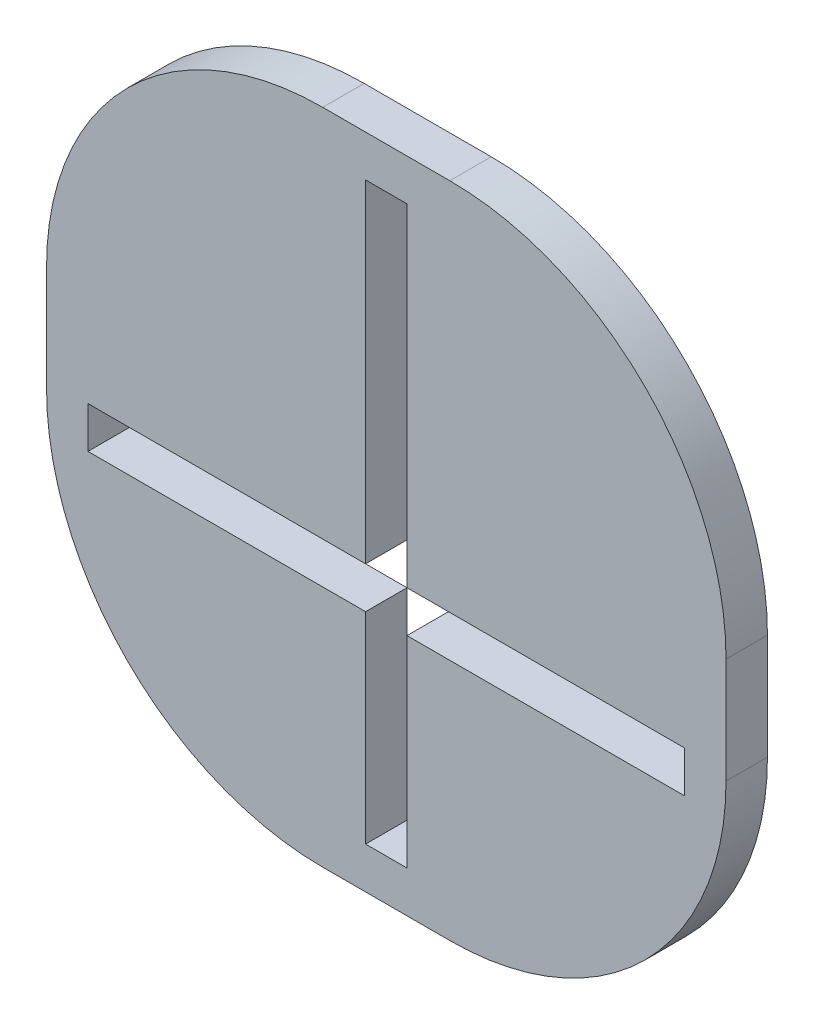
ISO-10303-21;
HEADER;
FILE_DESCRIPTION(('STEP AP214'),'2;1');
FILE_NAME('part.step','',(''),(''),'','','');
FILE_SCHEMA(('AUTOMOTIVE_DESIGN { 1 0 10303 214 1 1 1 1 }'));
ENDSEC;
DATA;
#1=APPLICATION_CONTEXT('core data for automotive mechanical design processes');
#2=APPLICATION_PROTOCOL_DEFINITION('international standard','automotive_design',2000,#1);
#3=PRODUCT_CONTEXT('',#1,'mechanical');
#4=PRODUCT('Part','Part','',(#3));
#5=PRODUCT_RELATED_PRODUCT_CATEGORY('part','',(#4));
#6=PRODUCT_DEFINITION_FORMATION('','',#4);
#7=PRODUCT_DEFINITION_CONTEXT('part definition',#1,'design');
#8=PRODUCT_DEFINITION('design','',#6,#7);
#9=PRODUCT_DEFINITION_SHAPE('','',#8);
#10=(LENGTH_UNIT() NAMED_UNIT(*) SI_UNIT(.MILLI.,.METRE.));
#11=(NAMED_UNIT(*) PLANE_ANGLE_UNIT() SI_UNIT($,.RADIAN.));
#12=(NAMED_UNIT(*) SI_UNIT($,.STERADIAN.) SOLID_ANGLE_UNIT());
#13=UNCERTAINTY_MEASURE_WITH_UNIT(LENGTH_MEASURE(1.E-05),#10,'distance_accuracy_value','');
#14=(GEOMETRIC_REPRESENTATION_CONTEXT(3) GLOBAL_UNCERTAINTY_ASSIGNED_CONTEXT((#13)) GLOBAL_UNIT_ASSIGNED_CONTEXT((#10,
#11,#12)) REPRESENTATION_CONTEXT('',''));
#15=CARTESIAN_POINT('',(0.,0.,0.));
#16=DIRECTION('',(0.,0.,1.));
#17=DIRECTION('',(1.,0.,0.));
#18=AXIS2_PLACEMENT_3D('',#15,#16,#17);
#19=CARTESIAN_POINT('',(0.,23.825,3.));
#20=DIRECTION('',(0.,-1.,0.));
#21=DIRECTION('',(1.,0.,0.));
#22=AXIS2_PLACEMENT_3D('',#19,#20,#21);
#23=PLANE('',#22);
#24=DIRECTION('',(-1.,0.,0.));
#25=VECTOR('',#24,1.);
#26=CARTESIAN_POINT('',(0.,23.825,0.));
#27=LINE('',#26,#25);
#28=CARTESIAN_POINT('',(4.59999999999999,23.825,0.));
#29=VERTEX_POINT('',#28);
#30=CARTESIAN_POINT('',(-4.60000000000002,23.825,0.));
#31=VERTEX_POINT('',#30);
#32=EDGE_CURVE('E254',#29,#31,#27,.T.);
#33=ORIENTED_EDGE('',*,*,#32,.T.);
#34=DIRECTION('',(0.,0.,-1.));
#35=VECTOR('',#34,1.);
#36=CARTESIAN_POINT('',(-4.60000000000002,23.825,3.));
#37=LINE('',#36,#35);
#38=CARTESIAN_POINT('',(-4.60000000000002,23.825,3.));
#39=VERTEX_POINT('',#38);
#40=EDGE_CURVE('E11',#39,#31,#37,.T.);
#41=ORIENTED_EDGE('',*,*,#40,.F.);
#42=DIRECTION('',(-1.,0.,0.));
#43=VECTOR('',#42,1.);
#44=CARTESIAN_POINT('',(0.,23.825,3.));
#45=LINE('',#44,#43);
#46=CARTESIAN_POINT('',(4.59999999999999,23.825,3.));
#47=VERTEX_POINT('',#46);
#48=EDGE_CURVE('E405',#47,#39,#45,.T.);
#49=ORIENTED_EDGE('',*,*,#48,.F.);
#50=DIRECTION('',(0.,0.,-1.));
#51=VECTOR('',#50,1.);
#52=CARTESIAN_POINT('',(4.59999999999999,23.825,3.));
#53=LINE('',#52,#51);
#54=EDGE_CURVE('E281',#47,#29,#53,.T.);
#55=ORIENTED_EDGE('',*,*,#54,.T.);
#56=EDGE_LOOP('',(#33,#41,#49,#55));
#57=FACE_BOUND('',#56,.T.);
#58=ADVANCED_FACE('F45',(#57),#23,.F.);
#59=CARTESIAN_POINT('',(-4.60000000000002,3.82500000000002,3.));
#60=DIRECTION('',(0.,0.,-1.));
#61=DIRECTION('',(-1.,0.,0.));
#62=AXIS2_PLACEMENT_3D('',#59,#60,#61);
#63=CYLINDRICAL_SURFACE('',#62,20.);
#64=CARTESIAN_POINT('',(-4.60000000000002,3.82500000000002,0.));
#65=DIRECTION('',(0.,0.,1.));
#66=DIRECTION('',(1.,0.,0.));
#67=AXIS2_PLACEMENT_3D('',#64,#65,#66);
#68=CIRCLE('',#67,20.);
#69=CARTESIAN_POINT('',(-24.6,3.82500000000001,0.));
#70=VERTEX_POINT('',#69);
#71=EDGE_CURVE('E258',#31,#70,#68,.T.);
#72=ORIENTED_EDGE('',*,*,#71,.T.);
#73=DIRECTION('',(0.,0.,-1.));
#74=VECTOR('',#73,1.);
#75=CARTESIAN_POINT('',(-24.6,3.82500000000001,3.));
#76=LINE('',#75,#74);
#77=CARTESIAN_POINT('',(-24.6,3.82500000000001,3.));
#78=VERTEX_POINT('',#77);
#79=EDGE_CURVE('E56',#78,#70,#76,.T.);
#80=ORIENTED_EDGE('',*,*,#79,.F.);
#81=CARTESIAN_POINT('',(-4.60000000000002,3.82500000000002,3.));
#82=DIRECTION('',(0.,0.,1.));
#83=DIRECTION('',(1.,0.,0.));
#84=AXIS2_PLACEMENT_3D('',#81,#82,#83);
#85=CIRCLE('',#84,20.);
#86=EDGE_CURVE('E408',#39,#78,#85,.T.);
#87=ORIENTED_EDGE('',*,*,#86,.F.);
#88=ORIENTED_EDGE('',*,*,#40,.T.);
#89=EDGE_LOOP('',(#72,#80,#87,#88));
#90=FACE_BOUND('',#89,.T.);
#91=ADVANCED_FACE('F440',(#90),#63,.T.);
#92=CARTESIAN_POINT('',(-24.6,0.,3.));
#93=DIRECTION('',(-1.,0.,0.));
#94=DIRECTION('',(0.,-1.,0.));
#95=AXIS2_PLACEMENT_3D('',#92,#93,#94);
#96=PLANE('',#95);
#97=DIRECTION('',(0.,1.,0.));
#98=VECTOR('',#97,1.);
#99=CARTESIAN_POINT('',(-24.6,0.,0.));
#100=LINE('',#99,#98);
#101=CARTESIAN_POINT('',(-24.6,-3.82500000000002,0.));
#102=VERTEX_POINT('',#101);
#103=EDGE_CURVE('E262',#102,#70,#100,.T.);
#104=ORIENTED_EDGE('',*,*,#103,.F.);
#105=DIRECTION('',(0.,0.,-1.));
#106=VECTOR('',#105,1.);
#107=CARTESIAN_POINT('',(-24.6,-3.82500000000002,3.));
#108=LINE('',#107,#106);
#109=CARTESIAN_POINT('',(-24.6,-3.82500000000002,3.));
#110=VERTEX_POINT('',#109);
#111=EDGE_CURVE('E291',#110,#102,#108,.T.);
#112=ORIENTED_EDGE('',*,*,#111,.F.);
#113=DIRECTION('',(0.,1.,0.));
#114=VECTOR('',#113,1.);
#115=CARTESIAN_POINT('',(-24.6,0.,3.));
#116=LINE('',#115,#114);
#117=EDGE_CURVE('E411',#110,#78,#116,.T.);
#118=ORIENTED_EDGE('',*,*,#117,.T.);
#119=ORIENTED_EDGE('',*,*,#79,.T.);
#120=EDGE_LOOP('',(#104,#112,#118,#119));
#121=FACE_BOUND('',#120,.T.);
#122=ADVANCED_FACE('F445',(#121),#96,.T.);
#123=CARTESIAN_POINT('',(-4.60000000000002,-3.82500000000001,3.));
#124=DIRECTION('',(0.,0.,-1.));
#125=DIRECTION('',(-1.,0.,0.));
#126=AXIS2_PLACEMENT_3D('',#123,#124,#125);
#127=CYLINDRICAL_SURFACE('',#126,20.);
#128=CARTESIAN_POINT('',(-4.60000000000002,-3.82500000000001,0.));
#129=DIRECTION('',(0.,0.,1.));
#130=DIRECTION('',(1.,0.,0.));
#131=AXIS2_PLACEMENT_3D('',#128,#129,#130);
#132=CIRCLE('',#131,20.);
#133=CARTESIAN_POINT('',(-4.60000000000001,-23.825,0.));
#134=VERTEX_POINT('',#133);
#135=EDGE_CURVE('E266',#134,#102,#132,.F.);
#136=ORIENTED_EDGE('',*,*,#135,.F.);
#137=DIRECTION('',(0.,0.,-1.));
#138=VECTOR('',#137,1.);
#139=CARTESIAN_POINT('',(-4.60000000000001,-23.825,3.));
#140=LINE('',#139,#138);
#141=CARTESIAN_POINT('',(-4.60000000000001,-23.825,3.));
#142=VERTEX_POINT('',#141);
#143=EDGE_CURVE('E288',#142,#134,#140,.T.);
#144=ORIENTED_EDGE('',*,*,#143,.F.);
#145=CARTESIAN_POINT('',(-4.60000000000002,-3.82500000000001,3.));
#146=DIRECTION('',(0.,0.,1.));
#147=DIRECTION('',(1.,0.,0.));
#148=AXIS2_PLACEMENT_3D('',#145,#146,#147);
#149=CIRCLE('',#148,20.);
#150=EDGE_CURVE('E415',#142,#110,#149,.F.);
#151=ORIENTED_EDGE('',*,*,#150,.T.);
#152=ORIENTED_EDGE('',*,*,#111,.T.);
#153=EDGE_LOOP('',(#136,#144,#151,#152));
#154=FACE_BOUND('',#153,.T.);
#155=ADVANCED_FACE('F608',(#154),#127,.T.);
#156=CARTESIAN_POINT('',(0.,-23.825,3.));
#157=DIRECTION('',(0.,-1.,0.));
#158=DIRECTION('',(1.,0.,0.));
#159=AXIS2_PLACEMENT_3D('',#156,#157,#158);
#160=PLANE('',#159);
#161=DIRECTION('',(-1.,0.,0.));
#162=VECTOR('',#161,1.);
#163=CARTESIAN_POINT('',(0.,-23.825,0.));
#164=LINE('',#163,#162);
#165=CARTESIAN_POINT('',(4.60000000000001,-23.825,0.));
#166=VERTEX_POINT('',#165);
#167=EDGE_CURVE('E270',#166,#134,#164,.T.);
#168=ORIENTED_EDGE('',*,*,#167,.F.);
#169=DIRECTION('',(0.,0.,-1.));
#170=VECTOR('',#169,1.);
#171=CARTESIAN_POINT('',(4.60000000000001,-23.825,3.));
#172=LINE('',#171,#170);
#173=CARTESIAN_POINT('',(4.60000000000001,-23.825,3.));
#174=VERTEX_POINT('',#173);
#175=EDGE_CURVE('E212',#174,#166,#172,.T.);
#176=ORIENTED_EDGE('',*,*,#175,.F.);
#177=DIRECTION('',(-1.,0.,0.));
#178=VECTOR('',#177,1.);
#179=CARTESIAN_POINT('',(0.,-23.825,3.));
#180=LINE('',#179,#178);
#181=EDGE_CURVE('E203',#174,#142,#180,.T.);
#182=ORIENTED_EDGE('',*,*,#181,.T.);
#183=ORIENTED_EDGE('',*,*,#143,.T.);
#184=EDGE_LOOP('',(#168,#176,#182,#183));
#185=FACE_BOUND('',#184,.T.);
#186=ADVANCED_FACE('F421',(#185),#160,.T.);
#187=CARTESIAN_POINT('',(4.6,-3.825,3.));
#188=DIRECTION('',(0.,0.,-1.));
#189=DIRECTION('',(-1.,0.,0.));
#190=AXIS2_PLACEMENT_3D('',#187,#188,#189);
#191=CYLINDRICAL_SURFACE('',#190,20.);
#192=CARTESIAN_POINT('',(4.6,-3.825,0.));
#193=DIRECTION('',(0.,0.,1.));
#194=DIRECTION('',(1.,0.,0.));
#195=AXIS2_PLACEMENT_3D('',#192,#193,#194);
#196=CIRCLE('',#195,20.);
#197=CARTESIAN_POINT('',(24.6,-3.825,0.));
#198=VERTEX_POINT('',#197);
#199=EDGE_CURVE('E210',#166,#198,#196,.T.);
#200=ORIENTED_EDGE('',*,*,#199,.T.);
#201=DIRECTION('',(0.,0.,-1.));
#202=VECTOR('',#201,1.);
#203=CARTESIAN_POINT('',(24.6,-3.825,3.));
#204=LINE('',#203,#202);
#205=CARTESIAN_POINT('',(24.6,-3.825,3.));
#206=VERTEX_POINT('',#205);
#207=EDGE_CURVE('E207',#206,#198,#204,.T.);
#208=ORIENTED_EDGE('',*,*,#207,.F.);
#209=CARTESIAN_POINT('',(4.6,-3.825,3.));
#210=DIRECTION('',(0.,0.,1.));
#211=DIRECTION('',(1.,0.,0.));
#212=AXIS2_PLACEMENT_3D('',#209,#210,#211);
#213=CIRCLE('',#212,20.);
#214=EDGE_CURVE('E196',#174,#206,#213,.T.);
#215=ORIENTED_EDGE('',*,*,#214,.F.);
#216=ORIENTED_EDGE('',*,*,#175,.T.);
#217=EDGE_LOOP('',(#200,#208,#215,#216));
#218=FACE_BOUND('',#217,.T.);
#219=ADVANCED_FACE('F208',(#218),#191,.T.);
#220=CARTESIAN_POINT('',(24.6,0.,3.));
#221=DIRECTION('',(-1.,0.,0.));
#222=DIRECTION('',(0.,-1.,0.));
#223=AXIS2_PLACEMENT_3D('',#220,#221,#222);
#224=PLANE('',#223);
#225=DIRECTION('',(0.,1.,0.));
#226=VECTOR('',#225,1.);
#227=CARTESIAN_POINT('',(24.6,0.,0.));
#228=LINE('',#227,#226);
#229=CARTESIAN_POINT('',(24.6,3.82500000000002,0.));
#230=VERTEX_POINT('',#229);
#231=EDGE_CURVE('E130',#198,#230,#228,.T.);
#232=ORIENTED_EDGE('',*,*,#231,.T.);
#233=DIRECTION('',(0.,0.,-1.));
#234=VECTOR('',#233,1.);
#235=CARTESIAN_POINT('',(24.6,3.82500000000002,3.));
#236=LINE('',#235,#234);
#237=CARTESIAN_POINT('',(24.6,3.82500000000002,3.));
#238=VERTEX_POINT('',#237);
#239=EDGE_CURVE('E213',#238,#230,#236,.T.);
#240=ORIENTED_EDGE('',*,*,#239,.F.);
#241=DIRECTION('',(0.,1.,0.));
#242=VECTOR('',#241,1.);
#243=CARTESIAN_POINT('',(24.6,0.,3.));
#244=LINE('',#243,#242);
#245=EDGE_CURVE('E200',#206,#238,#244,.T.);
#246=ORIENTED_EDGE('',*,*,#245,.F.);
#247=ORIENTED_EDGE('',*,*,#207,.T.);
#248=EDGE_LOOP('',(#232,#240,#246,#247));
#249=FACE_BOUND('',#248,.T.);
#250=ADVANCED_FACE('F215',(#249),#224,.F.);
#251=CARTESIAN_POINT('',(0.,20.825,3.));
#252=DIRECTION('',(0.,1.,0.));
#253=DIRECTION('',(0.,0.,1.));
#254=AXIS2_PLACEMENT_3D('',#251,#252,#253);
#255=PLANE('',#254);
#256=DIRECTION('',(1.,0.,0.));
#257=VECTOR('',#256,1.);
#258=CARTESIAN_POINT('',(0.,20.825,0.));
#259=LINE('',#258,#257);
#260=CARTESIAN_POINT('',(-1.50000000000001,20.825,0.));
#261=VERTEX_POINT('',#260);
#262=CARTESIAN_POINT('',(1.50000000000001,20.825,0.));
#263=VERTEX_POINT('',#262);
#264=EDGE_CURVE('E223',#261,#263,#259,.T.);
#265=ORIENTED_EDGE('',*,*,#264,.T.);
#266=DIRECTION('',(0.,0.,-1.));
#267=VECTOR('',#266,1.);
#268=CARTESIAN_POINT('',(1.50000000000001,20.825,3.));
#269=LINE('',#268,#267);
#270=CARTESIAN_POINT('',(1.50000000000001,20.825,3.));
#271=VERTEX_POINT('',#270);
#272=EDGE_CURVE('E49',#271,#263,#269,.T.);
#273=ORIENTED_EDGE('',*,*,#272,.F.);
#274=DIRECTION('',(1.,0.,0.));
#275=VECTOR('',#274,1.);
#276=CARTESIAN_POINT('',(0.,20.825,3.));
#277=LINE('',#276,#275);
#278=CARTESIAN_POINT('',(-1.50000000000001,20.825,3.));
#279=VERTEX_POINT('',#278);
#280=EDGE_CURVE('E280',#279,#271,#277,.T.);
#281=ORIENTED_EDGE('',*,*,#280,.F.);
#282=DIRECTION('',(0.,0.,-1.));
#283=VECTOR('',#282,1.);
#284=CARTESIAN_POINT('',(-1.50000000000001,20.825,3.));
#285=LINE('',#284,#283);
#286=EDGE_CURVE('E219',#279,#261,#285,.T.);
#287=ORIENTED_EDGE('',*,*,#286,.T.);
#288=EDGE_LOOP('',(#265,#273,#281,#287));
#289=FACE_BOUND('',#288,.T.);
#290=ADVANCED_FACE('F47',(#289),#255,.F.);
#291=CARTESIAN_POINT('',(1.50000000000001,0.,3.));
#292=DIRECTION('',(1.,0.,0.));
#293=DIRECTION('',(0.,0.,-1.));
#294=AXIS2_PLACEMENT_3D('',#291,#292,#293);
#295=PLANE('',#294);
#296=DIRECTION('',(0.,-1.,0.));
#297=VECTOR('',#296,1.);
#298=CARTESIAN_POINT('',(1.50000000000001,0.,0.));
#299=LINE('',#298,#297);
#300=CARTESIAN_POINT('',(1.50000000000001,-3.25,0.));
#301=VERTEX_POINT('',#300);
#302=EDGE_CURVE('E227',#263,#301,#299,.T.);
#303=ORIENTED_EDGE('',*,*,#302,.T.);
#304=DIRECTION('',(0.,0.,-1.));
#305=VECTOR('',#304,1.);
#306=CARTESIAN_POINT('',(1.50000000000001,-3.25,3.));
#307=LINE('',#306,#305);
#308=CARTESIAN_POINT('',(1.50000000000001,-3.25,3.));
#309=VERTEX_POINT('',#308);
#310=EDGE_CURVE('E329',#309,#301,#307,.T.);
#311=ORIENTED_EDGE('',*,*,#310,.F.);
#312=DIRECTION('',(0.,-1.,0.));
#313=VECTOR('',#312,1.);
#314=CARTESIAN_POINT('',(1.50000000000001,0.,3.));
#315=LINE('',#314,#313);
#316=EDGE_CURVE('E145',#271,#309,#315,.T.);
#317=ORIENTED_EDGE('',*,*,#316,.F.);
#318=ORIENTED_EDGE('',*,*,#272,.T.);
#319=EDGE_LOOP('',(#303,#311,#317,#318));
#320=FACE_BOUND('',#319,.T.);
#321=ADVANCED_FACE('F337',(#320),#295,.F.);
#322=CARTESIAN_POINT('',(0.,-3.25,3.));
#323=DIRECTION('',(0.,1.,0.));
#324=DIRECTION('',(0.,0.,1.));
#325=AXIS2_PLACEMENT_3D('',#322,#323,#324);
#326=PLANE('',#325);
#327=DIRECTION('',(1.,0.,0.));
#328=VECTOR('',#327,1.);
#329=CARTESIAN_POINT('',(0.,-3.25,0.));
#330=LINE('',#329,#328);
#331=CARTESIAN_POINT('',(21.6,-3.25,0.));
#332=VERTEX_POINT('',#331);
#333=EDGE_CURVE('E230',#301,#332,#330,.T.);
#334=ORIENTED_EDGE('',*,*,#333,.T.);
#335=DIRECTION('',(0.,0.,-1.));
#336=VECTOR('',#335,1.);
#337=CARTESIAN_POINT('',(21.6,-3.25,3.));
#338=LINE('',#337,#336);
#339=CARTESIAN_POINT('',(21.6,-3.25,3.));
#340=VERTEX_POINT('',#339);
#341=EDGE_CURVE('E326',#340,#332,#338,.T.);
#342=ORIENTED_EDGE('',*,*,#341,.F.);
#343=DIRECTION('',(1.,0.,0.));
#344=VECTOR('',#343,1.);
#345=CARTESIAN_POINT('',(0.,-3.25,3.));
#346=LINE('',#345,#344);
#347=EDGE_CURVE('E477',#309,#340,#346,.T.);
#348=ORIENTED_EDGE('',*,*,#347,.F.);
#349=ORIENTED_EDGE('',*,*,#310,.T.);
#350=EDGE_LOOP('',(#334,#342,#348,#349));
#351=FACE_BOUND('',#350,.T.);
#352=ADVANCED_FACE('F452',(#351),#326,.F.);
#353=CARTESIAN_POINT('',(21.6,0.,3.));
#354=DIRECTION('',(1.,0.,0.));
#355=DIRECTION('',(0.,0.,-1.));
#356=AXIS2_PLACEMENT_3D('',#353,#354,#355);
#357=PLANE('',#356);
#358=DIRECTION('',(0.,-1.,0.));
#359=VECTOR('',#358,1.);
#360=CARTESIAN_POINT('',(21.6,0.,0.));
#361=LINE('',#360,#359);
#362=CARTESIAN_POINT('',(21.6,-6.25,0.));
#363=VERTEX_POINT('',#362);
#364=EDGE_CURVE('E234',#332,#363,#361,.T.);
#365=ORIENTED_EDGE('',*,*,#364,.T.);
#366=DIRECTION('',(0.,0.,-1.));
#367=VECTOR('',#366,1.);
#368=CARTESIAN_POINT('',(21.6,-6.25,3.));
#369=LINE('',#368,#367);
#370=CARTESIAN_POINT('',(21.6,-6.25,3.));
#371=VERTEX_POINT('',#370);
#372=EDGE_CURVE('E322',#371,#363,#369,.T.);
#373=ORIENTED_EDGE('',*,*,#372,.F.);
#374=DIRECTION('',(0.,-1.,0.));
#375=VECTOR('',#374,1.);
#376=CARTESIAN_POINT('',(21.6,0.,3.));
#377=LINE('',#376,#375);
#378=EDGE_CURVE('E475',#340,#371,#377,.T.);
#379=ORIENTED_EDGE('',*,*,#378,.F.);
#380=ORIENTED_EDGE('',*,*,#341,.T.);
#381=EDGE_LOOP('',(#365,#373,#379,#380));
#382=FACE_BOUND('',#381,.T.);
#383=ADVANCED_FACE('F461',(#382),#357,.F.);
#384=CARTESIAN_POINT('',(0.,-6.25,3.));
#385=DIRECTION('',(0.,-1.,0.));
#386=DIRECTION('',(0.,0.,-1.));
#387=AXIS2_PLACEMENT_3D('',#384,#385,#386);
#388=PLANE('',#387);
#389=DIRECTION('',(-1.,0.,0.));
#390=VECTOR('',#389,1.);
#391=CARTESIAN_POINT('',(0.,-6.25,0.));
#392=LINE('',#391,#390);
#393=CARTESIAN_POINT('',(1.50000000000001,-6.25,0.));
#394=VERTEX_POINT('',#393);
#395=EDGE_CURVE('E238',#363,#394,#392,.T.);
#396=ORIENTED_EDGE('',*,*,#395,.T.);
#397=DIRECTION('',(0.,0.,-1.));
#398=VECTOR('',#397,1.);
#399=CARTESIAN_POINT('',(1.50000000000001,-6.25,3.));
#400=LINE('',#399,#398);
#401=CARTESIAN_POINT('',(1.50000000000001,-6.25,3.));
#402=VERTEX_POINT('',#401);
#403=EDGE_CURVE('E318',#402,#394,#400,.T.);
#404=ORIENTED_EDGE('',*,*,#403,.F.);
#405=DIRECTION('',(-1.,0.,0.));
#406=VECTOR('',#405,1.);
#407=CARTESIAN_POINT('',(0.,-6.25,3.));
#408=LINE('',#407,#406);
#409=EDGE_CURVE('E397',#371,#402,#408,.T.);
#410=ORIENTED_EDGE('',*,*,#409,.F.);
#411=ORIENTED_EDGE('',*,*,#372,.T.);
#412=EDGE_LOOP('',(#396,#404,#410,#411));
#413=FACE_BOUND('',#412,.T.);
#414=ADVANCED_FACE('F457',(#413),#388,.F.);
#415=CARTESIAN_POINT('',(1.50000000000001,-20.825,0.));
#416=VERTEX_POINT('',#415);
#417=EDGE_CURVE('E231',#394,#416,#299,.T.);
#418=ORIENTED_EDGE('',*,*,#417,.T.);
#419=DIRECTION('',(0.,0.,-1.));
#420=VECTOR('',#419,1.);
#421=CARTESIAN_POINT('',(1.50000000000001,-20.825,3.));
#422=LINE('',#421,#420);
#423=CARTESIAN_POINT('',(1.50000000000001,-20.825,3.));
#424=VERTEX_POINT('',#423);
#425=EDGE_CURVE('E315',#424,#416,#422,.T.);
#426=ORIENTED_EDGE('',*,*,#425,.F.);
#427=EDGE_CURVE('E391',#402,#424,#315,.T.);
#428=ORIENTED_EDGE('',*,*,#427,.F.);
#429=ORIENTED_EDGE('',*,*,#403,.T.);
#430=EDGE_LOOP('',(#418,#426,#428,#429));
#431=FACE_BOUND('',#430,.T.);
#432=ADVANCED_FACE('F377',(#431),#295,.F.);
#433=CARTESIAN_POINT('',(0.,-20.825,3.));
#434=DIRECTION('',(0.,1.,0.));
#435=DIRECTION('',(0.,0.,1.));
#436=AXIS2_PLACEMENT_3D('',#433,#434,#435);
#437=PLANE('',#436);
#438=DIRECTION('',(1.,0.,0.));
#439=VECTOR('',#438,1.);
#440=CARTESIAN_POINT('',(0.,-20.825,0.));
#441=LINE('',#440,#439);
#442=CARTESIAN_POINT('',(-1.50000000000001,-20.825,0.));
#443=VERTEX_POINT('',#442);
#444=EDGE_CURVE('E242',#443,#416,#441,.T.);
#445=ORIENTED_EDGE('',*,*,#444,.F.);
#446=DIRECTION('',(0.,0.,-1.));
#447=VECTOR('',#446,1.);
#448=CARTESIAN_POINT('',(-1.50000000000001,-20.825,3.));
#449=LINE('',#448,#447);
#450=CARTESIAN_POINT('',(-1.50000000000001,-20.825,3.));
#451=VERTEX_POINT('',#450);
#452=EDGE_CURVE('E312',#451,#443,#449,.T.);
#453=ORIENTED_EDGE('',*,*,#452,.F.);
#454=DIRECTION('',(1.,0.,0.));
#455=VECTOR('',#454,1.);
#456=CARTESIAN_POINT('',(0.,-20.825,3.));
#457=LINE('',#456,#455);
#458=EDGE_CURVE('E386',#451,#424,#457,.T.);
#459=ORIENTED_EDGE('',*,*,#458,.T.);
#460=ORIENTED_EDGE('',*,*,#425,.T.);
#461=EDGE_LOOP('',(#445,#453,#459,#460));
#462=FACE_BOUND('',#461,.T.);
#463=ADVANCED_FACE('F384',(#462),#437,.T.);
#464=CARTESIAN_POINT('',(-1.50000000000001,0.,3.));
#465=DIRECTION('',(1.,0.,0.));
#466=DIRECTION('',(0.,0.,-1.));
#467=AXIS2_PLACEMENT_3D('',#464,#465,#466);
#468=PLANE('',#467);
#469=DIRECTION('',(0.,-1.,0.));
#470=VECTOR('',#469,1.);
#471=CARTESIAN_POINT('',(-1.50000000000001,0.,0.));
#472=LINE('',#471,#470);
#473=CARTESIAN_POINT('',(-1.50000000000001,-6.25,0.));
#474=VERTEX_POINT('',#473);
#475=EDGE_CURVE('E246',#474,#443,#472,.T.);
#476=ORIENTED_EDGE('',*,*,#475,.F.);
#477=DIRECTION('',(0.,0.,-1.));
#478=VECTOR('',#477,1.);
#479=CARTESIAN_POINT('',(-1.50000000000001,-6.25,3.));
#480=LINE('',#479,#478);
#481=CARTESIAN_POINT('',(-1.50000000000001,-6.25,3.));
#482=VERTEX_POINT('',#481);
#483=EDGE_CURVE('E309',#482,#474,#480,.T.);
#484=ORIENTED_EDGE('',*,*,#483,.F.);
#485=DIRECTION('',(0.,-1.,0.));
#486=VECTOR('',#485,1.);
#487=CARTESIAN_POINT('',(-1.50000000000001,0.,3.));
#488=LINE('',#487,#486);
#489=EDGE_CURVE('E390',#482,#451,#488,.T.);
#490=ORIENTED_EDGE('',*,*,#489,.T.);
#491=ORIENTED_EDGE('',*,*,#452,.T.);
#492=EDGE_LOOP('',(#476,#484,#490,#491));
#493=FACE_BOUND('',#492,.T.);
#494=ADVANCED_FACE('F436',(#493),#468,.T.);
#495=CARTESIAN_POINT('',(-21.6,-6.25,0.));
#496=VERTEX_POINT('',#495);
#497=EDGE_CURVE('E241',#474,#496,#392,.T.);
#498=ORIENTED_EDGE('',*,*,#497,.T.);
#499=DIRECTION('',(0.,0.,-1.));
#500=VECTOR('',#499,1.);
#501=CARTESIAN_POINT('',(-21.6,-6.25,3.));
#502=LINE('',#501,#500);
#503=CARTESIAN_POINT('',(-21.6,-6.25,3.));
#504=VERTEX_POINT('',#503);
#505=EDGE_CURVE('E305',#504,#496,#502,.T.);
#506=ORIENTED_EDGE('',*,*,#505,.F.);
#507=EDGE_CURVE('E369',#482,#504,#408,.T.);
#508=ORIENTED_EDGE('',*,*,#507,.F.);
#509=ORIENTED_EDGE('',*,*,#483,.T.);
#510=EDGE_LOOP('',(#498,#506,#508,#509));
#511=FACE_BOUND('',#510,.T.);
#512=ADVANCED_FACE('F368',(#511),#388,.F.);
#513=CARTESIAN_POINT('',(-21.6,0.,3.));
#514=DIRECTION('',(-1.,0.,0.));
#515=DIRECTION('',(0.,0.,1.));
#516=AXIS2_PLACEMENT_3D('',#513,#514,#515);
#517=PLANE('',#516);
#518=DIRECTION('',(0.,1.,0.));
#519=VECTOR('',#518,1.);
#520=CARTESIAN_POINT('',(-21.6,0.,0.));
#521=LINE('',#520,#519);
#522=CARTESIAN_POINT('',(-21.6,-3.25,0.));
#523=VERTEX_POINT('',#522);
#524=EDGE_CURVE('E251',#496,#523,#521,.T.);
#525=ORIENTED_EDGE('',*,*,#524,.T.);
#526=DIRECTION('',(0.,0.,-1.));
#527=VECTOR('',#526,1.);
#528=CARTESIAN_POINT('',(-21.6,-3.25,3.));
#529=LINE('',#528,#527);
#530=CARTESIAN_POINT('',(-21.6,-3.25,3.));
#531=VERTEX_POINT('',#530);
#532=EDGE_CURVE('E301',#531,#523,#529,.T.);
#533=ORIENTED_EDGE('',*,*,#532,.F.);
#534=DIRECTION('',(0.,1.,0.));
#535=VECTOR('',#534,1.);
#536=CARTESIAN_POINT('',(-21.6,0.,3.));
#537=LINE('',#536,#535);
#538=EDGE_CURVE('E365',#504,#531,#537,.T.);
#539=ORIENTED_EDGE('',*,*,#538,.F.);
#540=ORIENTED_EDGE('',*,*,#505,.T.);
#541=EDGE_LOOP('',(#525,#533,#539,#540));
#542=FACE_BOUND('',#541,.T.);
#543=ADVANCED_FACE('F362',(#542),#517,.F.);
#544=CARTESIAN_POINT('',(-1.50000000000001,-3.25,0.));
#545=VERTEX_POINT('',#544);
#546=EDGE_CURVE('E235',#523,#545,#330,.T.);
#547=ORIENTED_EDGE('',*,*,#546,.T.);
#548=DIRECTION('',(0.,0.,-1.));
#549=VECTOR('',#548,1.);
#550=CARTESIAN_POINT('',(-1.50000000000001,-3.25,3.));
#551=LINE('',#550,#549);
#552=CARTESIAN_POINT('',(-1.50000000000001,-3.25,3.));
#553=VERTEX_POINT('',#552);
#554=EDGE_CURVE('E298',#553,#545,#551,.T.);
#555=ORIENTED_EDGE('',*,*,#554,.F.);
#556=EDGE_CURVE('E404',#531,#553,#346,.T.);
#557=ORIENTED_EDGE('',*,*,#556,.F.);
#558=ORIENTED_EDGE('',*,*,#532,.T.);
#559=EDGE_LOOP('',(#547,#555,#557,#558));
#560=FACE_BOUND('',#559,.T.);
#561=ADVANCED_FACE('F355',(#560),#326,.F.);
#562=EDGE_CURVE('E250',#261,#545,#472,.T.);
#563=ORIENTED_EDGE('',*,*,#562,.F.);
#564=ORIENTED_EDGE('',*,*,#286,.F.);
#565=EDGE_CURVE('E396',#279,#553,#488,.T.);
#566=ORIENTED_EDGE('',*,*,#565,.T.);
#567=ORIENTED_EDGE('',*,*,#554,.T.);
#568=EDGE_LOOP('',(#563,#564,#566,#567));
#569=FACE_BOUND('',#568,.T.);
#570=ADVANCED_FACE('F348',(#569),#468,.T.);
#571=CARTESIAN_POINT('',(4.6,3.82500000000002,3.));
#572=DIRECTION('',(0.,0.,-1.));
#573=DIRECTION('',(-1.,0.,0.));
#574=AXIS2_PLACEMENT_3D('',#571,#572,#573);
#575=CYLINDRICAL_SURFACE('',#574,20.);
#576=CARTESIAN_POINT('',(4.6,3.82500000000002,0.));
#577=DIRECTION('',(0.,0.,1.));
#578=DIRECTION('',(1.,0.,0.));
#579=AXIS2_PLACEMENT_3D('',#576,#577,#578);
#580=CIRCLE('',#579,20.);
#581=EDGE_CURVE('E136',#230,#29,#580,.T.);
#582=ORIENTED_EDGE('',*,*,#581,.T.);
#583=ORIENTED_EDGE('',*,*,#54,.F.);
#584=CARTESIAN_POINT('',(4.6,3.82500000000002,3.));
#585=DIRECTION('',(0.,0.,1.));
#586=DIRECTION('',(1.,0.,0.));
#587=AXIS2_PLACEMENT_3D('',#584,#585,#586);
#588=CIRCLE('',#587,20.);
#589=EDGE_CURVE('E65',#238,#47,#588,.T.);
#590=ORIENTED_EDGE('',*,*,#589,.F.);
#591=ORIENTED_EDGE('',*,*,#239,.T.);
#592=EDGE_LOOP('',(#582,#583,#590,#591));
#593=FACE_BOUND('',#592,.T.);
#594=ADVANCED_FACE('F427',(#593),#575,.T.);
#595=CARTESIAN_POINT('',(0.,0.,3.));
#596=DIRECTION('',(0.,0.,1.));
#597=DIRECTION('',(1.,0.,0.));
#598=AXIS2_PLACEMENT_3D('',#595,#596,#597);
#599=PLANE('',#598);
#600=ORIENTED_EDGE('',*,*,#280,.T.);
#601=ORIENTED_EDGE('',*,*,#316,.T.);
#602=ORIENTED_EDGE('',*,*,#347,.T.);
#603=ORIENTED_EDGE('',*,*,#378,.T.);
#604=ORIENTED_EDGE('',*,*,#409,.T.);
#605=ORIENTED_EDGE('',*,*,#427,.T.);
#606=ORIENTED_EDGE('',*,*,#458,.F.);
#607=ORIENTED_EDGE('',*,*,#489,.F.);
#608=ORIENTED_EDGE('',*,*,#507,.T.);
#609=ORIENTED_EDGE('',*,*,#538,.T.);
#610=ORIENTED_EDGE('',*,*,#556,.T.);
#611=ORIENTED_EDGE('',*,*,#565,.F.);
#612=EDGE_LOOP('',(#600,#601,#602,#603,#604,#605,#606,#607,#608,#609,#610,#611));
#613=FACE_BOUND('',#612,.T.);
#614=ORIENTED_EDGE('',*,*,#48,.T.);
#615=ORIENTED_EDGE('',*,*,#86,.T.);
#616=ORIENTED_EDGE('',*,*,#117,.F.);
#617=ORIENTED_EDGE('',*,*,#150,.F.);
#618=ORIENTED_EDGE('',*,*,#181,.F.);
#619=ORIENTED_EDGE('',*,*,#214,.T.);
#620=ORIENTED_EDGE('',*,*,#245,.T.);
#621=ORIENTED_EDGE('',*,*,#589,.T.);
#622=EDGE_LOOP('',(#614,#615,#616,#617,#618,#619,#620,#621));
#623=FACE_BOUND('',#622,.T.);
#624=ADVANCED_FACE('F198',(#613,#623),#599,.T.);
#625=CARTESIAN_POINT('',(0.,0.,0.));
#626=DIRECTION('',(0.,0.,1.));
#627=DIRECTION('',(1.,0.,0.));
#628=AXIS2_PLACEMENT_3D('',#625,#626,#627);
#629=PLANE('',#628);
#630=ORIENTED_EDGE('',*,*,#264,.F.);
#631=ORIENTED_EDGE('',*,*,#562,.T.);
#632=ORIENTED_EDGE('',*,*,#546,.F.);
#633=ORIENTED_EDGE('',*,*,#524,.F.);
#634=ORIENTED_EDGE('',*,*,#497,.F.);
#635=ORIENTED_EDGE('',*,*,#475,.T.);
#636=ORIENTED_EDGE('',*,*,#444,.T.);
#637=ORIENTED_EDGE('',*,*,#417,.F.);
#638=ORIENTED_EDGE('',*,*,#395,.F.);
#639=ORIENTED_EDGE('',*,*,#364,.F.);
#640=ORIENTED_EDGE('',*,*,#333,.F.);
#641=ORIENTED_EDGE('',*,*,#302,.F.);
#642=EDGE_LOOP('',(#630,#631,#632,#633,#634,#635,#636,#637,#638,#639,#640,#641));
#643=FACE_BOUND('',#642,.T.);
#644=ORIENTED_EDGE('',*,*,#32,.F.);
#645=ORIENTED_EDGE('',*,*,#581,.F.);
#646=ORIENTED_EDGE('',*,*,#231,.F.);
#647=ORIENTED_EDGE('',*,*,#199,.F.);
#648=ORIENTED_EDGE('',*,*,#167,.T.);
#649=ORIENTED_EDGE('',*,*,#135,.T.);
#650=ORIENTED_EDGE('',*,*,#103,.T.);
#651=ORIENTED_EDGE('',*,*,#71,.F.);
#652=EDGE_LOOP('',(#644,#645,#646,#647,#648,#649,#650,#651));
#653=FACE_BOUND('',#652,.T.);
#654=ADVANCED_FACE('F344',(#643,#653),#629,.F.);
#655=CLOSED_SHELL('',(#58,#91,#122,#155,#186,#219,#250,#290,#321,#352,#383,#414,#432,#463,#494,
#512,#543,#561,#570,#594,#624,#654));
#656=MANIFOLD_SOLID_BREP('B2',#655);
#657=ADVANCED_BREP_SHAPE_REPRESENTATION('',(#18,#656),#14);
#658=SHAPE_DEFINITION_REPRESENTATION(#9,#657);
ENDSEC;
END-ISO-10303-21;
